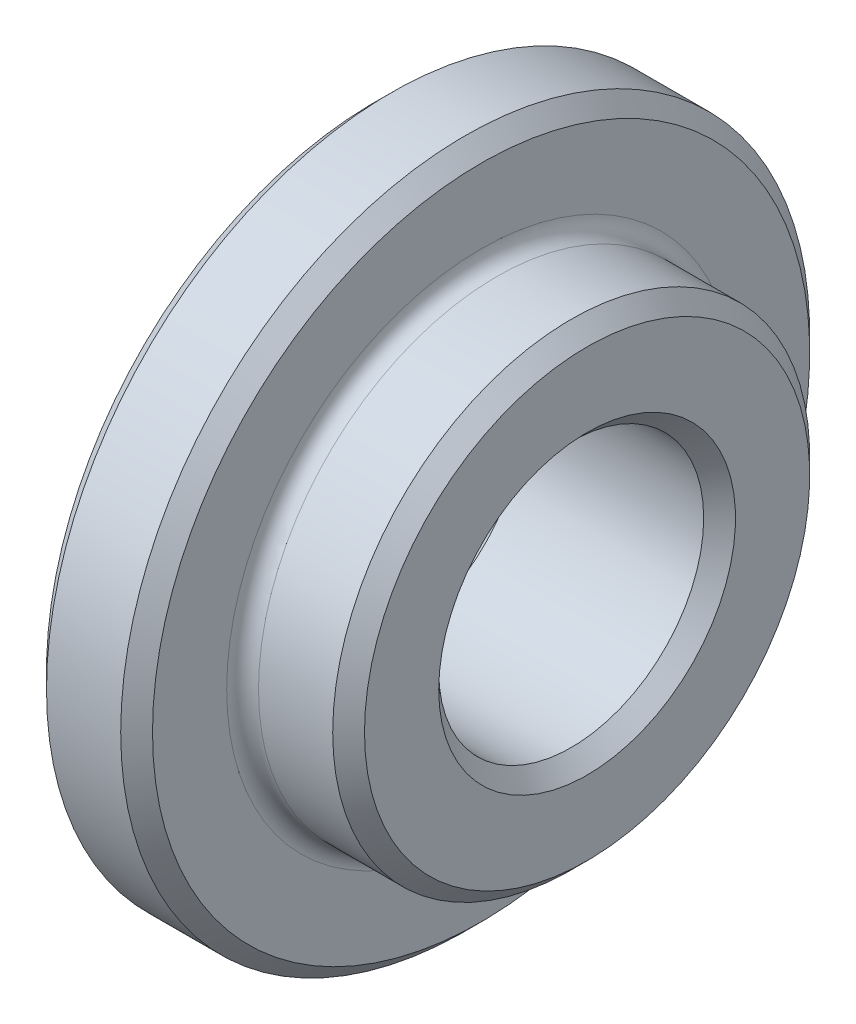
ISO-10303-21;
HEADER;
FILE_DESCRIPTION(('STEP AP214'),'2;1');
FILE_NAME('part.step','',(''),(''),'','','');
FILE_SCHEMA(('AUTOMOTIVE_DESIGN { 1 0 10303 214 1 1 1 1 }'));
ENDSEC;
DATA;
#1=APPLICATION_CONTEXT('core data for automotive mechanical design processes');
#2=APPLICATION_PROTOCOL_DEFINITION('international standard','automotive_design',2000,#1);
#3=PRODUCT_CONTEXT('',#1,'mechanical');
#4=PRODUCT('Part','Part','',(#3));
#5=PRODUCT_RELATED_PRODUCT_CATEGORY('part','',(#4));
#6=PRODUCT_DEFINITION_FORMATION('','',#4);
#7=PRODUCT_DEFINITION_CONTEXT('part definition',#1,'design');
#8=PRODUCT_DEFINITION('design','',#6,#7);
#9=PRODUCT_DEFINITION_SHAPE('','',#8);
#10=(LENGTH_UNIT() NAMED_UNIT(*) SI_UNIT(.MILLI.,.METRE.));
#11=(NAMED_UNIT(*) PLANE_ANGLE_UNIT() SI_UNIT($,.RADIAN.));
#12=(NAMED_UNIT(*) SI_UNIT($,.STERADIAN.) SOLID_ANGLE_UNIT());
#13=UNCERTAINTY_MEASURE_WITH_UNIT(LENGTH_MEASURE(1.E-05),#10,'distance_accuracy_value','');
#14=(GEOMETRIC_REPRESENTATION_CONTEXT(3) GLOBAL_UNCERTAINTY_ASSIGNED_CONTEXT((#13)) GLOBAL_UNIT_ASSIGNED_CONTEXT((#10,
#11,#12)) REPRESENTATION_CONTEXT('',''));
#15=CARTESIAN_POINT('',(0.,0.,0.));
#16=DIRECTION('',(0.,0.,1.));
#17=DIRECTION('',(1.,0.,0.));
#18=AXIS2_PLACEMENT_3D('',#15,#16,#17);
#19=CARTESIAN_POINT('',(0.,6.5,0.));
#20=DIRECTION('',(1.,0.,0.));
#21=DIRECTION('',(0.,0.,-1.));
#22=AXIS2_PLACEMENT_3D('',#19,#20,#21);
#23=PLANE('',#22);
#24=CARTESIAN_POINT('',(0.,0.,0.));
#25=DIRECTION('',(1.,0.,0.));
#26=DIRECTION('',(0.,0.,-1.));
#27=AXIS2_PLACEMENT_3D('',#24,#25,#26);
#28=CIRCLE('',#27,2.8);
#29=CARTESIAN_POINT('',(0.,0.,-2.8));
#30=VERTEX_POINT('',#29);
#31=EDGE_CURVE('E50',#30,#30,#28,.T.);
#32=ORIENTED_EDGE('',*,*,#31,.T.);
#33=EDGE_LOOP('',(#32));
#34=FACE_BOUND('',#33,.T.);
#35=CARTESIAN_POINT('',(0.,0.,0.));
#36=DIRECTION('',(1.,0.,0.));
#37=DIRECTION('',(0.,0.,-1.));
#38=AXIS2_PLACEMENT_3D('',#35,#36,#37);
#39=CIRCLE('',#38,6.2);
#40=CARTESIAN_POINT('',(0.,0.,-6.2));
#41=VERTEX_POINT('',#40);
#42=EDGE_CURVE('E53',#41,#41,#39,.F.);
#43=ORIENTED_EDGE('',*,*,#42,.T.);
#44=EDGE_LOOP('',(#43));
#45=FACE_BOUND('',#44,.T.);
#46=ADVANCED_FACE('F25',(#34,#45),#23,.F.);
#47=CARTESIAN_POINT('',(0.,0.,0.));
#48=DIRECTION('',(-1.,0.,0.));
#49=DIRECTION('',(0.,0.,1.));
#50=AXIS2_PLACEMENT_3D('',#47,#48,#49);
#51=CYLINDRICAL_SURFACE('',#50,2.5);
#52=CARTESIAN_POINT('',(0.300000000000004,0.,0.));
#53=DIRECTION('',(1.,0.,0.));
#54=DIRECTION('',(0.,0.,-1.));
#55=AXIS2_PLACEMENT_3D('',#52,#53,#54);
#56=CIRCLE('',#55,2.5);
#57=CARTESIAN_POINT('',(0.300000000000004,0.,-2.5));
#58=VERTEX_POINT('',#57);
#59=EDGE_CURVE('E56',#58,#58,#56,.F.);
#60=ORIENTED_EDGE('',*,*,#59,.T.);
#61=EDGE_LOOP('',(#60));
#62=FACE_BOUND('',#61,.T.);
#63=CARTESIAN_POINT('',(3.70000000000001,0.,0.));
#64=DIRECTION('',(-1.,0.,0.));
#65=DIRECTION('',(0.,0.,1.));
#66=AXIS2_PLACEMENT_3D('',#63,#64,#65);
#67=CIRCLE('',#66,2.5);
#68=CARTESIAN_POINT('',(3.70000000000001,0.,2.5));
#69=VERTEX_POINT('',#68);
#70=EDGE_CURVE('E59',#69,#69,#67,.F.);
#71=ORIENTED_EDGE('',*,*,#70,.T.);
#72=EDGE_LOOP('',(#71));
#73=FACE_BOUND('',#72,.T.);
#74=ADVANCED_FACE('F87',(#62,#73),#51,.F.);
#75=CARTESIAN_POINT('',(4.,2.5,0.));
#76=DIRECTION('',(-1.,0.,0.));
#77=DIRECTION('',(0.,0.,1.));
#78=AXIS2_PLACEMENT_3D('',#75,#76,#77);
#79=PLANE('',#78);
#80=CARTESIAN_POINT('',(4.,0.,0.));
#81=DIRECTION('',(-1.,0.,0.));
#82=DIRECTION('',(0.,0.,1.));
#83=AXIS2_PLACEMENT_3D('',#80,#81,#82);
#84=CIRCLE('',#83,2.8);
#85=CARTESIAN_POINT('',(4.,0.,2.8));
#86=VERTEX_POINT('',#85);
#87=EDGE_CURVE('E44',#86,#86,#84,.T.);
#88=ORIENTED_EDGE('',*,*,#87,.T.);
#89=EDGE_LOOP('',(#88));
#90=FACE_BOUND('',#89,.T.);
#91=CARTESIAN_POINT('',(4.,0.,0.));
#92=DIRECTION('',(-1.,0.,0.));
#93=DIRECTION('',(0.,0.,1.));
#94=AXIS2_PLACEMENT_3D('',#91,#92,#93);
#95=CIRCLE('',#94,4.19999999999999);
#96=CARTESIAN_POINT('',(4.,0.,4.19999999999999));
#97=VERTEX_POINT('',#96);
#98=EDGE_CURVE('E47',#97,#97,#95,.F.);
#99=ORIENTED_EDGE('',*,*,#98,.T.);
#100=EDGE_LOOP('',(#99));
#101=FACE_BOUND('',#100,.T.);
#102=ADVANCED_FACE('F92',(#90,#101),#79,.F.);
#103=CARTESIAN_POINT('',(0.,0.,0.));
#104=DIRECTION('',(-1.,0.,0.));
#105=DIRECTION('',(0.,0.,1.));
#106=AXIS2_PLACEMENT_3D('',#103,#104,#105);
#107=CYLINDRICAL_SURFACE('',#106,4.5);
#108=CARTESIAN_POINT('',(3.7,0.,0.));
#109=DIRECTION('',(-1.,0.,0.));
#110=DIRECTION('',(0.,0.,1.));
#111=AXIS2_PLACEMENT_3D('',#108,#109,#110);
#112=CIRCLE('',#111,4.5);
#113=CARTESIAN_POINT('',(3.7,0.,4.5));
#114=VERTEX_POINT('',#113);
#115=EDGE_CURVE('E39',#114,#114,#112,.T.);
#116=ORIENTED_EDGE('',*,*,#115,.T.);
#117=EDGE_LOOP('',(#116));
#118=FACE_BOUND('',#117,.T.);
#119=CARTESIAN_POINT('',(2.3,0.,0.));
#120=DIRECTION('',(-1.,0.,0.));
#121=DIRECTION('',(0.,0.,1.));
#122=AXIS2_PLACEMENT_3D('',#119,#120,#121);
#123=CIRCLE('',#122,4.5);
#124=CARTESIAN_POINT('',(2.3,0.,4.5));
#125=VERTEX_POINT('',#124);
#126=EDGE_CURVE('E62',#125,#125,#123,.F.);
#127=ORIENTED_EDGE('',*,*,#126,.T.);
#128=EDGE_LOOP('',(#127));
#129=FACE_BOUND('',#128,.T.);
#130=ADVANCED_FACE('F124',(#118,#129),#107,.T.);
#131=CARTESIAN_POINT('',(2.,4.5,0.));
#132=DIRECTION('',(-1.,0.,0.));
#133=DIRECTION('',(0.,0.,1.));
#134=AXIS2_PLACEMENT_3D('',#131,#132,#133);
#135=PLANE('',#134);
#136=CARTESIAN_POINT('',(2.,0.,0.));
#137=DIRECTION('',(-1.,0.,0.));
#138=DIRECTION('',(0.,0.,1.));
#139=AXIS2_PLACEMENT_3D('',#136,#137,#138);
#140=CIRCLE('',#139,6.2);
#141=CARTESIAN_POINT('',(2.,0.,6.2));
#142=VERTEX_POINT('',#141);
#143=EDGE_CURVE('E10',#142,#142,#140,.F.);
#144=ORIENTED_EDGE('',*,*,#143,.T.);
#145=EDGE_LOOP('',(#144));
#146=FACE_BOUND('',#145,.T.);
#147=CARTESIAN_POINT('',(2.,0.,0.));
#148=DIRECTION('',(-1.,0.,0.));
#149=DIRECTION('',(0.,0.,1.));
#150=AXIS2_PLACEMENT_3D('',#147,#148,#149);
#151=CIRCLE('',#150,4.8);
#152=CARTESIAN_POINT('',(2.,0.,4.8));
#153=VERTEX_POINT('',#152);
#154=EDGE_CURVE('E65',#153,#153,#151,.T.);
#155=ORIENTED_EDGE('',*,*,#154,.T.);
#156=EDGE_LOOP('',(#155));
#157=FACE_BOUND('',#156,.T.);
#158=ADVANCED_FACE('F69',(#146,#157),#135,.F.);
#159=CARTESIAN_POINT('',(0.,0.,0.));
#160=DIRECTION('',(-1.,0.,0.));
#161=DIRECTION('',(0.,0.,1.));
#162=AXIS2_PLACEMENT_3D('',#159,#160,#161);
#163=CYLINDRICAL_SURFACE('',#162,6.5);
#164=CARTESIAN_POINT('',(1.7,0.,0.));
#165=DIRECTION('',(-1.,0.,0.));
#166=DIRECTION('',(0.,0.,1.));
#167=AXIS2_PLACEMENT_3D('',#164,#165,#166);
#168=CIRCLE('',#167,6.5);
#169=CARTESIAN_POINT('',(1.7,0.,6.5));
#170=VERTEX_POINT('',#169);
#171=EDGE_CURVE('E31',#170,#170,#168,.T.);
#172=ORIENTED_EDGE('',*,*,#171,.T.);
#173=EDGE_LOOP('',(#172));
#174=FACE_BOUND('',#173,.T.);
#175=CARTESIAN_POINT('',(0.299999999999997,0.,0.));
#176=DIRECTION('',(1.,0.,0.));
#177=DIRECTION('',(0.,0.,-1.));
#178=AXIS2_PLACEMENT_3D('',#175,#176,#177);
#179=CIRCLE('',#178,6.5);
#180=CARTESIAN_POINT('',(0.299999999999997,0.,-6.5));
#181=VERTEX_POINT('',#180);
#182=EDGE_CURVE('E35',#181,#181,#179,.T.);
#183=ORIENTED_EDGE('',*,*,#182,.T.);
#184=EDGE_LOOP('',(#183));
#185=FACE_BOUND('',#184,.T.);
#186=ADVANCED_FACE('F74',(#174,#185),#163,.T.);
#187=CARTESIAN_POINT('',(2.3,0.,0.));
#188=DIRECTION('',(-1.,0.,0.));
#189=DIRECTION('',(0.,0.,1.));
#190=AXIS2_PLACEMENT_3D('',#187,#188,#189);
#191=TOROIDAL_SURFACE('',#190,4.8,0.3);
#192=ORIENTED_EDGE('',*,*,#126,.F.);
#193=EDGE_LOOP('',(#192));
#194=FACE_BOUND('',#193,.T.);
#195=ORIENTED_EDGE('',*,*,#154,.F.);
#196=EDGE_LOOP('',(#195));
#197=FACE_BOUND('',#196,.T.);
#198=ADVANCED_FACE('F71',(#194,#197),#191,.F.);
#199=CARTESIAN_POINT('',(0.300000000000004,0.,0.));
#200=DIRECTION('',(-1.,0.,0.));
#201=DIRECTION('',(0.,0.,1.));
#202=AXIS2_PLACEMENT_3D('',#199,#200,#201);
#203=CONICAL_SURFACE('',#202,2.5,0.785398163397446);
#204=ORIENTED_EDGE('',*,*,#31,.F.);
#205=EDGE_LOOP('',(#204));
#206=FACE_BOUND('',#205,.T.);
#207=ORIENTED_EDGE('',*,*,#59,.F.);
#208=EDGE_LOOP('',(#207));
#209=FACE_BOUND('',#208,.T.);
#210=ADVANCED_FACE('F73',(#206,#209),#203,.F.);
#211=CARTESIAN_POINT('',(4.,0.,0.));
#212=DIRECTION('',(1.,0.,0.));
#213=DIRECTION('',(0.,0.,-1.));
#214=AXIS2_PLACEMENT_3D('',#211,#212,#213);
#215=CONICAL_SURFACE('',#214,2.8,0.785398163397448);
#216=ORIENTED_EDGE('',*,*,#70,.F.);
#217=EDGE_LOOP('',(#216));
#218=FACE_BOUND('',#217,.T.);
#219=ORIENTED_EDGE('',*,*,#87,.F.);
#220=EDGE_LOOP('',(#219));
#221=FACE_BOUND('',#220,.T.);
#222=ADVANCED_FACE('F81',(#218,#221),#215,.F.);
#223=CARTESIAN_POINT('',(3.7,0.,0.));
#224=DIRECTION('',(-1.,0.,0.));
#225=DIRECTION('',(0.,0.,1.));
#226=AXIS2_PLACEMENT_3D('',#223,#224,#225);
#227=CONICAL_SURFACE('',#226,4.5,0.78539816339745);
#228=CARTESIAN_POINT('',(4.,0.,4.19999999999999));
#229=CARTESIAN_POINT('',(3.996875,0.,4.20312499999999));
#230=CARTESIAN_POINT('',(3.99375,0.,4.20624999999999));
#231=CARTESIAN_POINT('',(3.9875,0.,4.21249999999999));
#232=CARTESIAN_POINT('',(3.984375,0.,4.21562499999999));
#233=CARTESIAN_POINT('',(3.978125,0.,4.22187499999999));
#234=CARTESIAN_POINT('',(3.975,0.,4.22499999999999));
#235=CARTESIAN_POINT('',(3.96875,0.,4.23124999999999));
#236=CARTESIAN_POINT('',(3.965625,0.,4.23437499999999));
#237=CARTESIAN_POINT('',(3.959375,0.,4.24062499999999));
#238=CARTESIAN_POINT('',(3.95625,0.,4.24374999999999));
#239=CARTESIAN_POINT('',(3.95,0.,4.24999999999999));
#240=CARTESIAN_POINT('',(3.946875,0.,4.25312499999999));
#241=CARTESIAN_POINT('',(3.940625,0.,4.25937499999999));
#242=CARTESIAN_POINT('',(3.9375,0.,4.26249999999999));
#243=CARTESIAN_POINT('',(3.93125,0.,4.26874999999999));
#244=CARTESIAN_POINT('',(3.928125,0.,4.271875));
#245=CARTESIAN_POINT('',(3.921875,0.,4.27812499999999));
#246=CARTESIAN_POINT('',(3.91875,0.,4.28125));
#247=CARTESIAN_POINT('',(3.9125,0.,4.28749999999999));
#248=CARTESIAN_POINT('',(3.909375,0.,4.290625));
#249=CARTESIAN_POINT('',(3.903125,0.,4.296875));
#250=CARTESIAN_POINT('',(3.9,0.,4.3));
#251=CARTESIAN_POINT('',(3.89375,0.,4.30625));
#252=CARTESIAN_POINT('',(3.890625,0.,4.309375));
#253=CARTESIAN_POINT('',(3.884375,0.,4.315625));
#254=CARTESIAN_POINT('',(3.88125,0.,4.31875));
#255=CARTESIAN_POINT('',(3.875,0.,4.325));
#256=CARTESIAN_POINT('',(3.871875,0.,4.328125));
#257=CARTESIAN_POINT('',(3.865625,0.,4.334375));
#258=CARTESIAN_POINT('',(3.8625,0.,4.3375));
#259=CARTESIAN_POINT('',(3.85625,0.,4.34375));
#260=CARTESIAN_POINT('',(3.853125,0.,4.346875));
#261=CARTESIAN_POINT('',(3.846875,0.,4.353125));
#262=CARTESIAN_POINT('',(3.84375,0.,4.35625));
#263=CARTESIAN_POINT('',(3.8375,0.,4.3625));
#264=CARTESIAN_POINT('',(3.834375,0.,4.365625));
#265=CARTESIAN_POINT('',(3.828125,0.,4.371875));
#266=CARTESIAN_POINT('',(3.825,0.,4.375));
#267=CARTESIAN_POINT('',(3.81875,0.,4.38125));
#268=CARTESIAN_POINT('',(3.815625,0.,4.384375));
#269=CARTESIAN_POINT('',(3.809375,0.,4.390625));
#270=CARTESIAN_POINT('',(3.80625,0.,4.39375));
#271=CARTESIAN_POINT('',(3.8,0.,4.4));
#272=CARTESIAN_POINT('',(3.796875,0.,4.403125));
#273=CARTESIAN_POINT('',(3.790625,0.,4.409375));
#274=CARTESIAN_POINT('',(3.7875,0.,4.4125));
#275=CARTESIAN_POINT('',(3.78125,0.,4.41875));
#276=CARTESIAN_POINT('',(3.778125,0.,4.421875));
#277=CARTESIAN_POINT('',(3.771875,0.,4.428125));
#278=CARTESIAN_POINT('',(3.76875,0.,4.43125));
#279=CARTESIAN_POINT('',(3.7625,0.,4.4375));
#280=CARTESIAN_POINT('',(3.759375,0.,4.440625));
#281=CARTESIAN_POINT('',(3.753125,0.,4.446875));
#282=CARTESIAN_POINT('',(3.75,0.,4.45));
#283=CARTESIAN_POINT('',(3.74375,0.,4.45625));
#284=CARTESIAN_POINT('',(3.740625,0.,4.459375));
#285=CARTESIAN_POINT('',(3.734375,0.,4.465625));
#286=CARTESIAN_POINT('',(3.73125,0.,4.46875));
#287=CARTESIAN_POINT('',(3.725,0.,4.475));
#288=CARTESIAN_POINT('',(3.721875,0.,4.478125));
#289=CARTESIAN_POINT('',(3.715625,0.,4.484375));
#290=CARTESIAN_POINT('',(3.7125,0.,4.4875));
#291=CARTESIAN_POINT('',(3.70625,0.,4.49375));
#292=CARTESIAN_POINT('',(3.703125,0.,4.496875));
#293=CARTESIAN_POINT('',(3.7,0.,4.5));
#294=B_SPLINE_CURVE_WITH_KNOTS('',3,(#228,#229,#230,#231,#232,#233,#234,#235,#236,#237,#238,
#239,#240,#241,#242,#243,#244,#245,#246,#247,#248,#249,#250,#251,#252,#253,#254,#255,#256,#257,
#258,#259,#260,#261,#262,#263,#264,#265,#266,#267,#268,#269,#270,#271,#272,#273,#274,#275,#276,
#277,#278,#279,#280,#281,#282,#283,#284,#285,#286,#287,#288,#289,#290,#291,#292,#293),
.UNSPECIFIED.,.F.,.F.,(4,2,2,2,2,2,2,2,2,2,2,2,2,2,2,2,2,2,2,2,2,2,2,2,2,2,2,2,2,2,2,2,4),(0.,
0.0132582521472488,0.0265165042944963,0.0397747564417451,0.0530330085889926,0.0662912607362401,
0.0795495128834889,0.0928077650307364,0.106066017177985,0.119324269325233,0.132582521472481,
0.145840773619729,0.159099025766977,0.172357277914225,0.185615530061473,0.198873782208721,
0.212132034355969,0.225390286503217,0.238648538650465,0.251906790797713,0.265165042944961,
0.278423295092209,0.291681547239457,0.304939799386705,0.318198051533953,0.331456303681201,
0.344714555828449,0.357972807975697,0.371231060122945,0.384489312270193,0.397747564417441,
0.411005816564689,0.424264068711937),.UNSPECIFIED.);
#295=EDGE_CURVE('BSEAM106',#97,#114,#294,.T.);
#296=ORIENTED_EDGE('',*,*,#98,.F.);
#297=ORIENTED_EDGE('',*,*,#115,.F.);
#298=ORIENTED_EDGE('',*,*,#295,.T.);
#299=ORIENTED_EDGE('',*,*,#295,.F.);
#300=EDGE_LOOP('',(#296,#298,#297,#299));
#301=FACE_BOUND('',#300,.T.);
#302=ADVANCED_FACE('F106',(#301),#227,.T.);
#303=CARTESIAN_POINT('',(1.7,0.,0.));
#304=DIRECTION('',(-1.,0.,0.));
#305=DIRECTION('',(0.,0.,1.));
#306=AXIS2_PLACEMENT_3D('',#303,#304,#305);
#307=CONICAL_SURFACE('',#306,6.5,0.785398163397451);
#308=ORIENTED_EDGE('',*,*,#143,.F.);
#309=EDGE_LOOP('',(#308));
#310=FACE_BOUND('',#309,.T.);
#311=ORIENTED_EDGE('',*,*,#171,.F.);
#312=EDGE_LOOP('',(#311));
#313=FACE_BOUND('',#312,.T.);
#314=ADVANCED_FACE('F100',(#310,#313),#307,.T.);
#315=CARTESIAN_POINT('',(0.,0.,0.));
#316=DIRECTION('',(1.,0.,0.));
#317=DIRECTION('',(0.,0.,-1.));
#318=AXIS2_PLACEMENT_3D('',#315,#316,#317);
#319=CONICAL_SURFACE('',#318,6.2,0.78539816339745);
#320=ORIENTED_EDGE('',*,*,#182,.F.);
#321=EDGE_LOOP('',(#320));
#322=FACE_BOUND('',#321,.T.);
#323=ORIENTED_EDGE('',*,*,#42,.F.);
#324=EDGE_LOOP('',(#323));
#325=FACE_BOUND('',#324,.T.);
#326=ADVANCED_FACE('F98',(#322,#325),#319,.T.);
#327=CLOSED_SHELL('',(#46,#74,#102,#130,#158,#186,#198,#210,#222,#302,#314,#326));
#328=MANIFOLD_SOLID_BREP('B2',#327);
#329=ADVANCED_BREP_SHAPE_REPRESENTATION('',(#18,#328),#14);
#330=SHAPE_DEFINITION_REPRESENTATION(#9,#329);
ENDSEC;
END-ISO-10303-21;
